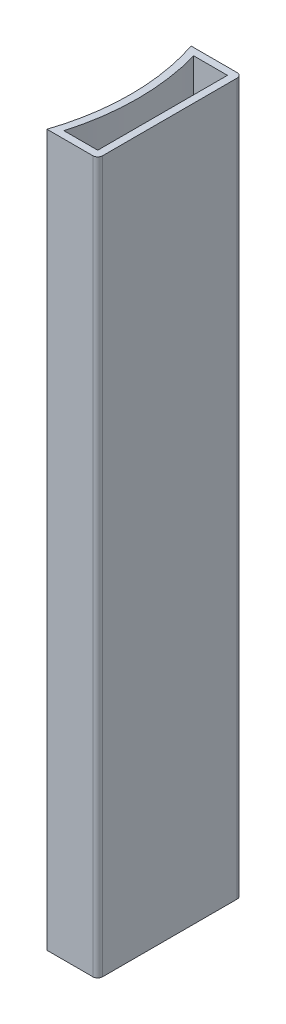
ISO-10303-21;
HEADER;
FILE_DESCRIPTION(('STEP AP214'),'2;1');
FILE_NAME('part.step','',(''),(''),'','','');
FILE_SCHEMA(('AUTOMOTIVE_DESIGN { 1 0 10303 214 1 1 1 1 }'));
ENDSEC;
DATA;
#1=APPLICATION_CONTEXT('core data for automotive mechanical design processes');
#2=APPLICATION_PROTOCOL_DEFINITION('international standard','automotive_design',2000,#1);
#3=PRODUCT_CONTEXT('',#1,'mechanical');
#4=PRODUCT('Part','Part','',(#3));
#5=PRODUCT_RELATED_PRODUCT_CATEGORY('part','',(#4));
#6=PRODUCT_DEFINITION_FORMATION('','',#4);
#7=PRODUCT_DEFINITION_CONTEXT('part definition',#1,'design');
#8=PRODUCT_DEFINITION('design','',#6,#7);
#9=PRODUCT_DEFINITION_SHAPE('','',#8);
#10=(LENGTH_UNIT() NAMED_UNIT(*) SI_UNIT(.MILLI.,.METRE.));
#11=(NAMED_UNIT(*) PLANE_ANGLE_UNIT() SI_UNIT($,.RADIAN.));
#12=(NAMED_UNIT(*) SI_UNIT($,.STERADIAN.) SOLID_ANGLE_UNIT());
#13=UNCERTAINTY_MEASURE_WITH_UNIT(LENGTH_MEASURE(1.E-05),#10,'distance_accuracy_value','');
#14=(GEOMETRIC_REPRESENTATION_CONTEXT(3) GLOBAL_UNCERTAINTY_ASSIGNED_CONTEXT((#13)) GLOBAL_UNIT_ASSIGNED_CONTEXT((#10,
#11,#12)) REPRESENTATION_CONTEXT('',''));
#15=CARTESIAN_POINT('',(0.,0.,0.));
#16=DIRECTION('',(0.,0.,1.));
#17=DIRECTION('',(1.,0.,0.));
#18=AXIS2_PLACEMENT_3D('',#15,#16,#17);
#19=CARTESIAN_POINT('',(-45.,0.,15.));
#20=DIRECTION('',(0.,1.,0.));
#21=DIRECTION('',(0.,0.,1.));
#22=AXIS2_PLACEMENT_3D('',#19,#20,#21);
#23=PLANE('',#22);
#24=DIRECTION('',(-1.,0.,0.));
#25=VECTOR('',#24,1.);
#26=CARTESIAN_POINT('',(0.,0.,0.));
#27=LINE('',#26,#25);
#28=CARTESIAN_POINT('',(9.57,0.,0.));
#29=VERTEX_POINT('',#28);
#30=CARTESIAN_POINT('',(0.,0.,0.));
#31=VERTEX_POINT('',#30);
#32=EDGE_CURVE('E142',#29,#31,#27,.T.);
#33=ORIENTED_EDGE('',*,*,#32,.F.);
#34=CARTESIAN_POINT('',(9.57,0.,1.));
#35=DIRECTION('',(0.,1.,0.));
#36=DIRECTION('',(0.,0.,1.));
#37=AXIS2_PLACEMENT_3D('',#34,#35,#36);
#38=CIRCLE('',#37,1.);
#39=CARTESIAN_POINT('',(10.57,0.,1.));
#40=VERTEX_POINT('',#39);
#41=EDGE_CURVE('E172',#29,#40,#38,.F.);
#42=ORIENTED_EDGE('',*,*,#41,.T.);
#43=DIRECTION('',(0.,0.,-1.));
#44=VECTOR('',#43,1.);
#45=CARTESIAN_POINT('',(10.57,0.,0.));
#46=LINE('',#45,#44);
#47=CARTESIAN_POINT('',(10.57,0.,29.));
#48=VERTEX_POINT('',#47);
#49=EDGE_CURVE('E158',#48,#40,#46,.T.);
#50=ORIENTED_EDGE('',*,*,#49,.F.);
#51=CARTESIAN_POINT('',(9.57,0.,29.));
#52=DIRECTION('',(0.,1.,0.));
#53=DIRECTION('',(0.,0.,1.));
#54=AXIS2_PLACEMENT_3D('',#51,#52,#53);
#55=CIRCLE('',#54,1.);
#56=CARTESIAN_POINT('',(9.57,0.,30.));
#57=VERTEX_POINT('',#56);
#58=EDGE_CURVE('E170',#48,#57,#55,.F.);
#59=ORIENTED_EDGE('',*,*,#58,.T.);
#60=DIRECTION('',(1.,0.,0.));
#61=VECTOR('',#60,1.);
#62=CARTESIAN_POINT('',(10.57,0.,30.));
#63=LINE('',#62,#61);
#64=CARTESIAN_POINT('',(0.,0.,30.));
#65=VERTEX_POINT('',#64);
#66=EDGE_CURVE('E154',#65,#57,#63,.T.);
#67=ORIENTED_EDGE('',*,*,#66,.F.);
#68=CARTESIAN_POINT('',(-45.,0.,15.));
#69=DIRECTION('',(0.,-1.,0.));
#70=DIRECTION('',(0.,0.,1.));
#71=AXIS2_PLACEMENT_3D('',#68,#69,#70);
#72=CIRCLE('',#71,47.4341649025257);
#73=EDGE_CURVE('E151',#31,#65,#72,.T.);
#74=ORIENTED_EDGE('',*,*,#73,.F.);
#75=EDGE_LOOP('',(#33,#42,#50,#59,#67,#74));
#76=FACE_BOUND('',#75,.T.);
#77=DIRECTION('',(0.,0.,-1.));
#78=VECTOR('',#77,1.);
#79=CARTESIAN_POINT('',(9.07,0.,0.));
#80=LINE('',#79,#78);
#81=CARTESIAN_POINT('',(9.07,0.,28.5));
#82=VERTEX_POINT('',#81);
#83=CARTESIAN_POINT('',(9.07,0.,1.5));
#84=VERTEX_POINT('',#83);
#85=EDGE_CURVE('E124',#82,#84,#80,.T.);
#86=ORIENTED_EDGE('',*,*,#85,.T.);
#87=DIRECTION('',(-1.,0.,0.));
#88=VECTOR('',#87,1.);
#89=CARTESIAN_POINT('',(0.,0.,1.5));
#90=LINE('',#89,#88);
#91=CARTESIAN_POINT('',(2.03511980113984,0.,1.5));
#92=VERTEX_POINT('',#91);
#93=EDGE_CURVE('E110',#84,#92,#90,.T.);
#94=ORIENTED_EDGE('',*,*,#93,.T.);
#95=CARTESIAN_POINT('',(-45.,0.,15.));
#96=DIRECTION('',(0.,1.,0.));
#97=DIRECTION('',(0.,0.,1.));
#98=AXIS2_PLACEMENT_3D('',#95,#96,#97);
#99=CIRCLE('',#98,48.9341649025257);
#100=CARTESIAN_POINT('',(2.03511980113985,0.,28.5));
#101=VERTEX_POINT('',#100);
#102=EDGE_CURVE('E117',#92,#101,#99,.F.);
#103=ORIENTED_EDGE('',*,*,#102,.T.);
#104=DIRECTION('',(1.,0.,0.));
#105=VECTOR('',#104,1.);
#106=CARTESIAN_POINT('',(10.57,0.,28.5));
#107=LINE('',#106,#105);
#108=EDGE_CURVE('E121',#101,#82,#107,.T.);
#109=ORIENTED_EDGE('',*,*,#108,.T.);
#110=EDGE_LOOP('',(#86,#94,#103,#109));
#111=FACE_BOUND('',#110,.T.);
#112=ADVANCED_FACE('F32',(#76,#111),#23,.F.);
#113=CARTESIAN_POINT('',(-45.,148.,15.));
#114=DIRECTION('',(0.,-1.,0.));
#115=DIRECTION('',(0.,0.,-1.));
#116=AXIS2_PLACEMENT_3D('',#113,#114,#115);
#117=CYLINDRICAL_SURFACE('',#116,47.4341649025257);
#118=ORIENTED_EDGE('',*,*,#73,.T.);
#119=DIRECTION('',(0.,-1.,0.));
#120=VECTOR('',#119,1.);
#121=CARTESIAN_POINT('',(0.,148.,30.));
#122=LINE('',#121,#120);
#123=CARTESIAN_POINT('',(0.,148.,30.));
#124=VERTEX_POINT('',#123);
#125=EDGE_CURVE('E164',#124,#65,#122,.T.);
#126=ORIENTED_EDGE('',*,*,#125,.F.);
#127=CARTESIAN_POINT('',(-45.,148.,15.));
#128=DIRECTION('',(0.,-1.,0.));
#129=DIRECTION('',(0.,0.,1.));
#130=AXIS2_PLACEMENT_3D('',#127,#128,#129);
#131=CIRCLE('',#130,47.4341649025257);
#132=CARTESIAN_POINT('',(0.,148.,0.));
#133=VERTEX_POINT('',#132);
#134=EDGE_CURVE('E138',#133,#124,#131,.T.);
#135=ORIENTED_EDGE('',*,*,#134,.F.);
#136=DIRECTION('',(0.,-1.,0.));
#137=VECTOR('',#136,1.);
#138=CARTESIAN_POINT('',(0.,148.,0.));
#139=LINE('',#138,#137);
#140=EDGE_CURVE('E150',#133,#31,#139,.T.);
#141=ORIENTED_EDGE('',*,*,#140,.T.);
#142=EDGE_LOOP('',(#118,#126,#135,#141));
#143=FACE_BOUND('',#142,.T.);
#144=ADVANCED_FACE('F207',(#143),#117,.F.);
#145=CARTESIAN_POINT('',(10.57,148.,30.));
#146=DIRECTION('',(0.,0.,-1.));
#147=DIRECTION('',(-1.,0.,0.));
#148=AXIS2_PLACEMENT_3D('',#145,#146,#147);
#149=PLANE('',#148);
#150=ORIENTED_EDGE('',*,*,#66,.T.);
#151=DIRECTION('',(0.,-1.,0.));
#152=VECTOR('',#151,1.);
#153=CARTESIAN_POINT('',(9.57,148.,30.));
#154=LINE('',#153,#152);
#155=CARTESIAN_POINT('',(9.57,148.,30.));
#156=VERTEX_POINT('',#155);
#157=EDGE_CURVE('E11',#57,#156,#154,.F.);
#158=ORIENTED_EDGE('',*,*,#157,.T.);
#159=DIRECTION('',(1.,0.,0.));
#160=VECTOR('',#159,1.);
#161=CARTESIAN_POINT('',(10.57,148.,30.));
#162=LINE('',#161,#160);
#163=EDGE_CURVE('E141',#124,#156,#162,.T.);
#164=ORIENTED_EDGE('',*,*,#163,.F.);
#165=ORIENTED_EDGE('',*,*,#125,.T.);
#166=EDGE_LOOP('',(#150,#158,#164,#165));
#167=FACE_BOUND('',#166,.T.);
#168=ADVANCED_FACE('F204',(#167),#149,.F.);
#169=CARTESIAN_POINT('',(10.57,148.,0.));
#170=DIRECTION('',(-1.,0.,0.));
#171=DIRECTION('',(0.,0.,1.));
#172=AXIS2_PLACEMENT_3D('',#169,#170,#171);
#173=PLANE('',#172);
#174=ORIENTED_EDGE('',*,*,#49,.T.);
#175=DIRECTION('',(0.,-1.,0.));
#176=VECTOR('',#175,1.);
#177=CARTESIAN_POINT('',(10.57,148.,1.));
#178=LINE('',#177,#176);
#179=CARTESIAN_POINT('',(10.57,148.,1.));
#180=VERTEX_POINT('',#179);
#181=EDGE_CURVE('E177',#40,#180,#178,.F.);
#182=ORIENTED_EDGE('',*,*,#181,.T.);
#183=DIRECTION('',(0.,0.,-1.));
#184=VECTOR('',#183,1.);
#185=CARTESIAN_POINT('',(10.57,148.,0.));
#186=LINE('',#185,#184);
#187=CARTESIAN_POINT('',(10.57,148.,29.));
#188=VERTEX_POINT('',#187);
#189=EDGE_CURVE('E145',#188,#180,#186,.T.);
#190=ORIENTED_EDGE('',*,*,#189,.F.);
#191=DIRECTION('',(0.,-1.,0.));
#192=VECTOR('',#191,1.);
#193=CARTESIAN_POINT('',(10.57,148.,29.));
#194=LINE('',#193,#192);
#195=EDGE_CURVE('E174',#188,#48,#194,.T.);
#196=ORIENTED_EDGE('',*,*,#195,.T.);
#197=EDGE_LOOP('',(#174,#182,#190,#196));
#198=FACE_BOUND('',#197,.T.);
#199=ADVANCED_FACE('F198',(#198),#173,.F.);
#200=CARTESIAN_POINT('',(0.,148.,0.));
#201=DIRECTION('',(0.,0.,1.));
#202=DIRECTION('',(1.,0.,0.));
#203=AXIS2_PLACEMENT_3D('',#200,#201,#202);
#204=PLANE('',#203);
#205=DIRECTION('',(-1.,0.,0.));
#206=VECTOR('',#205,1.);
#207=CARTESIAN_POINT('',(0.,148.,0.));
#208=LINE('',#207,#206);
#209=CARTESIAN_POINT('',(9.57,148.,0.));
#210=VERTEX_POINT('',#209);
#211=EDGE_CURVE('E148',#210,#133,#208,.T.);
#212=ORIENTED_EDGE('',*,*,#211,.F.);
#213=DIRECTION('',(0.,-1.,0.));
#214=VECTOR('',#213,1.);
#215=CARTESIAN_POINT('',(9.57,148.,0.));
#216=LINE('',#215,#214);
#217=EDGE_CURVE('E167',#210,#29,#216,.T.);
#218=ORIENTED_EDGE('',*,*,#217,.T.);
#219=ORIENTED_EDGE('',*,*,#32,.T.);
#220=ORIENTED_EDGE('',*,*,#140,.F.);
#221=EDGE_LOOP('',(#212,#218,#219,#220));
#222=FACE_BOUND('',#221,.T.);
#223=ADVANCED_FACE('F190',(#222),#204,.F.);
#224=CARTESIAN_POINT('',(-45.,148.,15.));
#225=DIRECTION('',(0.,1.,0.));
#226=DIRECTION('',(0.,0.,1.));
#227=AXIS2_PLACEMENT_3D('',#224,#225,#226);
#228=PLANE('',#227);
#229=DIRECTION('',(0.,0.,-1.));
#230=VECTOR('',#229,1.);
#231=CARTESIAN_POINT('',(9.07,148.,0.));
#232=LINE('',#231,#230);
#233=CARTESIAN_POINT('',(9.07,148.,28.5));
#234=VERTEX_POINT('',#233);
#235=CARTESIAN_POINT('',(9.07,148.,1.5));
#236=VERTEX_POINT('',#235);
#237=EDGE_CURVE('E134',#234,#236,#232,.T.);
#238=ORIENTED_EDGE('',*,*,#237,.F.);
#239=DIRECTION('',(1.,0.,0.));
#240=VECTOR('',#239,1.);
#241=CARTESIAN_POINT('',(10.57,148.,28.5));
#242=LINE('',#241,#240);
#243=CARTESIAN_POINT('',(2.03511980113985,148.,28.5));
#244=VERTEX_POINT('',#243);
#245=EDGE_CURVE('E127',#244,#234,#242,.T.);
#246=ORIENTED_EDGE('',*,*,#245,.F.);
#247=CARTESIAN_POINT('',(-45.,148.,15.));
#248=DIRECTION('',(0.,1.,0.));
#249=DIRECTION('',(0.,0.,1.));
#250=AXIS2_PLACEMENT_3D('',#247,#248,#249);
#251=CIRCLE('',#250,48.9341649025257);
#252=CARTESIAN_POINT('',(2.03511980113984,148.,1.5));
#253=VERTEX_POINT('',#252);
#254=EDGE_CURVE('E125',#253,#244,#251,.F.);
#255=ORIENTED_EDGE('',*,*,#254,.F.);
#256=DIRECTION('',(-1.,0.,0.));
#257=VECTOR('',#256,1.);
#258=CARTESIAN_POINT('',(0.,148.,1.5));
#259=LINE('',#258,#257);
#260=EDGE_CURVE('E113',#236,#253,#259,.T.);
#261=ORIENTED_EDGE('',*,*,#260,.F.);
#262=EDGE_LOOP('',(#238,#246,#255,#261));
#263=FACE_BOUND('',#262,.T.);
#264=ORIENTED_EDGE('',*,*,#189,.T.);
#265=CARTESIAN_POINT('',(9.57,148.,1.));
#266=DIRECTION('',(0.,1.,0.));
#267=DIRECTION('',(0.,0.,1.));
#268=AXIS2_PLACEMENT_3D('',#265,#266,#267);
#269=CIRCLE('',#268,1.);
#270=EDGE_CURVE('E40',#180,#210,#269,.T.);
#271=ORIENTED_EDGE('',*,*,#270,.T.);
#272=ORIENTED_EDGE('',*,*,#211,.T.);
#273=ORIENTED_EDGE('',*,*,#134,.T.);
#274=ORIENTED_EDGE('',*,*,#163,.T.);
#275=CARTESIAN_POINT('',(9.57,148.,29.));
#276=DIRECTION('',(0.,1.,0.));
#277=DIRECTION('',(0.,0.,1.));
#278=AXIS2_PLACEMENT_3D('',#275,#276,#277);
#279=CIRCLE('',#278,1.);
#280=EDGE_CURVE('E179',#156,#188,#279,.T.);
#281=ORIENTED_EDGE('',*,*,#280,.T.);
#282=EDGE_LOOP('',(#264,#271,#272,#273,#274,#281));
#283=FACE_BOUND('',#282,.T.);
#284=ADVANCED_FACE('F183',(#263,#283),#228,.T.);
#285=CARTESIAN_POINT('',(9.57,148.,1.));
#286=DIRECTION('',(0.,-1.,0.));
#287=DIRECTION('',(0.,0.,-1.));
#288=AXIS2_PLACEMENT_3D('',#285,#286,#287);
#289=CYLINDRICAL_SURFACE('',#288,1.);
#290=ORIENTED_EDGE('',*,*,#270,.F.);
#291=ORIENTED_EDGE('',*,*,#181,.F.);
#292=ORIENTED_EDGE('',*,*,#41,.F.);
#293=ORIENTED_EDGE('',*,*,#217,.F.);
#294=EDGE_LOOP('',(#290,#291,#292,#293));
#295=FACE_BOUND('',#294,.T.);
#296=ADVANCED_FACE('F193',(#295),#289,.T.);
#297=CARTESIAN_POINT('',(9.57,148.,29.));
#298=DIRECTION('',(0.,-1.,0.));
#299=DIRECTION('',(0.,0.,-1.));
#300=AXIS2_PLACEMENT_3D('',#297,#298,#299);
#301=CYLINDRICAL_SURFACE('',#300,1.);
#302=ORIENTED_EDGE('',*,*,#280,.F.);
#303=ORIENTED_EDGE('',*,*,#157,.F.);
#304=ORIENTED_EDGE('',*,*,#58,.F.);
#305=ORIENTED_EDGE('',*,*,#195,.F.);
#306=EDGE_LOOP('',(#302,#303,#304,#305));
#307=FACE_BOUND('',#306,.T.);
#308=ADVANCED_FACE('F34',(#307),#301,.T.);
#309=CARTESIAN_POINT('',(-45.,148.,15.));
#310=DIRECTION('',(0.,-1.,0.));
#311=DIRECTION('',(0.,0.,-1.));
#312=AXIS2_PLACEMENT_3D('',#309,#310,#311);
#313=CYLINDRICAL_SURFACE('',#312,48.9341649025257);
#314=ORIENTED_EDGE('',*,*,#102,.F.);
#315=DIRECTION('',(0.,-1.,0.));
#316=VECTOR('',#315,1.);
#317=CARTESIAN_POINT('',(2.03511980113984,148.,1.5));
#318=LINE('',#317,#316);
#319=EDGE_CURVE('E107',#253,#92,#318,.T.);
#320=ORIENTED_EDGE('',*,*,#319,.F.);
#321=ORIENTED_EDGE('',*,*,#254,.T.);
#322=DIRECTION('',(0.,-1.,0.));
#323=VECTOR('',#322,1.);
#324=CARTESIAN_POINT('',(2.03511980113985,148.,28.5));
#325=LINE('',#324,#323);
#326=EDGE_CURVE('E47',#244,#101,#325,.T.);
#327=ORIENTED_EDGE('',*,*,#326,.T.);
#328=EDGE_LOOP('',(#314,#320,#321,#327));
#329=FACE_BOUND('',#328,.T.);
#330=ADVANCED_FACE('F118',(#329),#313,.T.);
#331=CARTESIAN_POINT('',(10.57,148.,28.5));
#332=DIRECTION('',(0.,0.,-1.));
#333=DIRECTION('',(-1.,0.,0.));
#334=AXIS2_PLACEMENT_3D('',#331,#332,#333);
#335=PLANE('',#334);
#336=ORIENTED_EDGE('',*,*,#108,.F.);
#337=ORIENTED_EDGE('',*,*,#326,.F.);
#338=ORIENTED_EDGE('',*,*,#245,.T.);
#339=DIRECTION('',(0.,1.,0.));
#340=VECTOR('',#339,1.);
#341=CARTESIAN_POINT('',(9.07,148.,28.5));
#342=LINE('',#341,#340);
#343=EDGE_CURVE('E155',#82,#234,#342,.T.);
#344=ORIENTED_EDGE('',*,*,#343,.F.);
#345=EDGE_LOOP('',(#336,#337,#338,#344));
#346=FACE_BOUND('',#345,.T.);
#347=ADVANCED_FACE('F269',(#346),#335,.T.);
#348=CARTESIAN_POINT('',(9.07,148.,0.));
#349=DIRECTION('',(-1.,0.,0.));
#350=DIRECTION('',(0.,0.,1.));
#351=AXIS2_PLACEMENT_3D('',#348,#349,#350);
#352=PLANE('',#351);
#353=ORIENTED_EDGE('',*,*,#85,.F.);
#354=ORIENTED_EDGE('',*,*,#343,.T.);
#355=ORIENTED_EDGE('',*,*,#237,.T.);
#356=DIRECTION('',(0.,1.,0.));
#357=VECTOR('',#356,1.);
#358=CARTESIAN_POINT('',(9.07,148.,1.5));
#359=LINE('',#358,#357);
#360=EDGE_CURVE('E297',#84,#236,#359,.T.);
#361=ORIENTED_EDGE('',*,*,#360,.F.);
#362=EDGE_LOOP('',(#353,#354,#355,#361));
#363=FACE_BOUND('',#362,.T.);
#364=ADVANCED_FACE('F278',(#363),#352,.T.);
#365=CARTESIAN_POINT('',(0.,148.,1.5));
#366=DIRECTION('',(0.,0.,1.));
#367=DIRECTION('',(1.,0.,0.));
#368=AXIS2_PLACEMENT_3D('',#365,#366,#367);
#369=PLANE('',#368);
#370=ORIENTED_EDGE('',*,*,#260,.T.);
#371=ORIENTED_EDGE('',*,*,#319,.T.);
#372=ORIENTED_EDGE('',*,*,#93,.F.);
#373=ORIENTED_EDGE('',*,*,#360,.T.);
#374=EDGE_LOOP('',(#370,#371,#372,#373));
#375=FACE_BOUND('',#374,.T.);
#376=ADVANCED_FACE('F108',(#375),#369,.T.);
#377=CLOSED_SHELL('',(#112,#144,#168,#199,#223,#284,#296,#308,#330,#347,#364,#376));
#378=MANIFOLD_SOLID_BREP('B2',#377);
#379=ADVANCED_BREP_SHAPE_REPRESENTATION('',(#18,#378),#14);
#380=SHAPE_DEFINITION_REPRESENTATION(#9,#379);
ENDSEC;
END-ISO-10303-21;
